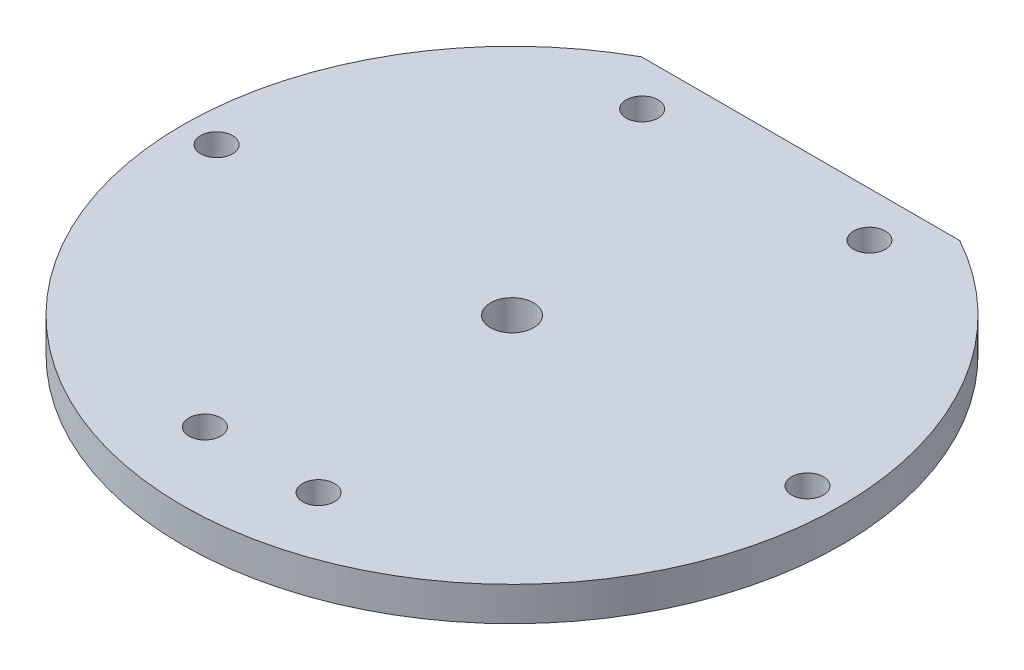
ISO-10303-21;
HEADER;
FILE_DESCRIPTION(('STEP AP214'),'2;1');
FILE_NAME('part.step','',(''),(''),'','','');
FILE_SCHEMA(('AUTOMOTIVE_DESIGN { 1 0 10303 214 1 1 1 1 }'));
ENDSEC;
DATA;
#1=APPLICATION_CONTEXT('core data for automotive mechanical design processes');
#2=APPLICATION_PROTOCOL_DEFINITION('international standard','automotive_design',2000,#1);
#3=PRODUCT_CONTEXT('',#1,'mechanical');
#4=PRODUCT('Part','Part','',(#3));
#5=PRODUCT_RELATED_PRODUCT_CATEGORY('part','',(#4));
#6=PRODUCT_DEFINITION_FORMATION('','',#4);
#7=PRODUCT_DEFINITION_CONTEXT('part definition',#1,'design');
#8=PRODUCT_DEFINITION('design','',#6,#7);
#9=PRODUCT_DEFINITION_SHAPE('','',#8);
#10=(LENGTH_UNIT() NAMED_UNIT(*) SI_UNIT(.MILLI.,.METRE.));
#11=(NAMED_UNIT(*) PLANE_ANGLE_UNIT() SI_UNIT($,.RADIAN.));
#12=(NAMED_UNIT(*) SI_UNIT($,.STERADIAN.) SOLID_ANGLE_UNIT());
#13=UNCERTAINTY_MEASURE_WITH_UNIT(LENGTH_MEASURE(1.E-05),#10,'distance_accuracy_value','');
#14=(GEOMETRIC_REPRESENTATION_CONTEXT(3) GLOBAL_UNCERTAINTY_ASSIGNED_CONTEXT((#13)) GLOBAL_UNIT_ASSIGNED_CONTEXT((#10,
#11,#12)) REPRESENTATION_CONTEXT('',''));
#15=CARTESIAN_POINT('',(0.,0.,0.));
#16=DIRECTION('',(0.,0.,1.));
#17=DIRECTION('',(1.,0.,0.));
#18=AXIS2_PLACEMENT_3D('',#15,#16,#17);
#19=CARTESIAN_POINT('',(0.,3.,0.));
#20=DIRECTION('',(0.,-1.,0.));
#21=DIRECTION('',(0.,0.,-1.));
#22=AXIS2_PLACEMENT_3D('',#19,#20,#21);
#23=CYLINDRICAL_SURFACE('',#22,29.);
#24=CARTESIAN_POINT('',(0.,3.,0.));
#25=DIRECTION('',(0.,1.,0.));
#26=DIRECTION('',(0.,0.,1.));
#27=AXIS2_PLACEMENT_3D('',#24,#25,#26);
#28=CIRCLE('',#27,29.);
#29=CARTESIAN_POINT('',(-14.,3.,-25.3968501984006));
#30=VERTEX_POINT('',#29);
#31=CARTESIAN_POINT('',(14.,3.,-25.3968501984006));
#32=VERTEX_POINT('',#31);
#33=EDGE_CURVE('E70',#30,#32,#28,.T.);
#34=ORIENTED_EDGE('',*,*,#33,.F.);
#35=DIRECTION('',(0.,1.,0.));
#36=VECTOR('',#35,1.);
#37=CARTESIAN_POINT('',(-14.,-7.,-25.3968501984006));
#38=LINE('',#37,#36);
#39=CARTESIAN_POINT('',(-14.,0.,-25.3968501984006));
#40=VERTEX_POINT('',#39);
#41=EDGE_CURVE('E63',#40,#30,#38,.T.);
#42=ORIENTED_EDGE('',*,*,#41,.F.);
#43=CARTESIAN_POINT('',(0.,0.,0.));
#44=DIRECTION('',(0.,1.,0.));
#45=DIRECTION('',(0.,0.,1.));
#46=AXIS2_PLACEMENT_3D('',#43,#44,#45);
#47=CIRCLE('',#46,29.);
#48=CARTESIAN_POINT('',(14.,0.,-25.3968501984006));
#49=VERTEX_POINT('',#48);
#50=EDGE_CURVE('E72',#40,#49,#47,.T.);
#51=ORIENTED_EDGE('',*,*,#50,.T.);
#52=DIRECTION('',(0.,1.,0.));
#53=VECTOR('',#52,1.);
#54=CARTESIAN_POINT('',(14.,-7.,-25.3968501984006));
#55=LINE('',#54,#53);
#56=EDGE_CURVE('E53',#49,#32,#55,.T.);
#57=ORIENTED_EDGE('',*,*,#56,.T.);
#58=EDGE_LOOP('',(#34,#42,#51,#57));
#59=FACE_BOUND('',#58,.T.);
#60=ADVANCED_FACE('F37',(#59),#23,.T.);
#61=CARTESIAN_POINT('',(0.,3.,0.));
#62=DIRECTION('',(0.,1.,0.));
#63=DIRECTION('',(0.,0.,1.));
#64=AXIS2_PLACEMENT_3D('',#61,#62,#63);
#65=PLANE('',#64);
#66=CARTESIAN_POINT('',(-5.,3.,22.0259541949482));
#67=DIRECTION('',(0.,1.,0.));
#68=DIRECTION('',(0.,0.,1.));
#69=AXIS2_PLACEMENT_3D('',#66,#67,#68);
#70=CIRCLE('',#69,1.4);
#71=CARTESIAN_POINT('',(-5.,3.,23.4259541949482));
#72=VERTEX_POINT('',#71);
#73=EDGE_CURVE('E101',#72,#72,#70,.T.);
#74=ORIENTED_EDGE('',*,*,#73,.F.);
#75=EDGE_LOOP('',(#74));
#76=FACE_BOUND('',#75,.T.);
#77=CARTESIAN_POINT('',(5.,3.,22.0259541949482));
#78=DIRECTION('',(0.,1.,0.));
#79=DIRECTION('',(0.,0.,-1.));
#80=AXIS2_PLACEMENT_3D('',#77,#78,#79);
#81=CIRCLE('',#80,1.4);
#82=CARTESIAN_POINT('',(5.,3.,20.6259541949482));
#83=VERTEX_POINT('',#82);
#84=EDGE_CURVE('E106',#83,#83,#81,.T.);
#85=ORIENTED_EDGE('',*,*,#84,.F.);
#86=EDGE_LOOP('',(#85));
#87=FACE_BOUND('',#86,.T.);
#88=DIRECTION('',(1.,0.,0.));
#89=VECTOR('',#88,1.);
#90=CARTESIAN_POINT('',(0.,3.,-25.3968501984006));
#91=LINE('',#90,#89);
#92=EDGE_CURVE('E61',#30,#32,#91,.T.);
#93=ORIENTED_EDGE('',*,*,#92,.F.);
#94=ORIENTED_EDGE('',*,*,#33,.T.);
#95=EDGE_LOOP('',(#93,#94));
#96=FACE_BOUND('',#95,.T.);
#97=CARTESIAN_POINT('',(-10.,3.,-21.4516570642615));
#98=DIRECTION('',(0.,1.,0.));
#99=DIRECTION('',(0.,0.,1.));
#100=AXIS2_PLACEMENT_3D('',#97,#98,#99);
#101=CIRCLE('',#100,1.4);
#102=CARTESIAN_POINT('',(-10.,3.,-20.0516570642616));
#103=VERTEX_POINT('',#102);
#104=EDGE_CURVE('E96',#103,#103,#101,.T.);
#105=ORIENTED_EDGE('',*,*,#104,.F.);
#106=EDGE_LOOP('',(#105));
#107=FACE_BOUND('',#106,.T.);
#108=CARTESIAN_POINT('',(10.,3.,-21.4516570642616));
#109=DIRECTION('',(0.,1.,0.));
#110=DIRECTION('',(0.,0.,1.));
#111=AXIS2_PLACEMENT_3D('',#108,#109,#110);
#112=CIRCLE('',#111,1.4);
#113=CARTESIAN_POINT('',(10.,3.,-20.0516570642616));
#114=VERTEX_POINT('',#113);
#115=EDGE_CURVE('E113',#114,#114,#112,.T.);
#116=ORIENTED_EDGE('',*,*,#115,.F.);
#117=EDGE_LOOP('',(#116));
#118=FACE_BOUND('',#117,.T.);
#119=CARTESIAN_POINT('',(26.,3.,0.));
#120=DIRECTION('',(0.,1.,0.));
#121=DIRECTION('',(0.,0.,1.));
#122=AXIS2_PLACEMENT_3D('',#119,#120,#121);
#123=CIRCLE('',#122,1.4);
#124=CARTESIAN_POINT('',(26.,3.,1.4));
#125=VERTEX_POINT('',#124);
#126=EDGE_CURVE('E88',#125,#125,#123,.T.);
#127=ORIENTED_EDGE('',*,*,#126,.F.);
#128=EDGE_LOOP('',(#127));
#129=FACE_BOUND('',#128,.T.);
#130=CARTESIAN_POINT('',(-26.,3.,0.));
#131=DIRECTION('',(0.,1.,0.));
#132=DIRECTION('',(0.,0.,-1.));
#133=AXIS2_PLACEMENT_3D('',#130,#131,#132);
#134=CIRCLE('',#133,1.4);
#135=CARTESIAN_POINT('',(-26.,3.,-1.4));
#136=VERTEX_POINT('',#135);
#137=EDGE_CURVE('E98',#136,#136,#134,.T.);
#138=ORIENTED_EDGE('',*,*,#137,.F.);
#139=EDGE_LOOP('',(#138));
#140=FACE_BOUND('',#139,.T.);
#141=CARTESIAN_POINT('',(0.,3.,0.));
#142=DIRECTION('',(0.,1.,0.));
#143=DIRECTION('',(0.,0.,1.));
#144=AXIS2_PLACEMENT_3D('',#141,#142,#143);
#145=CIRCLE('',#144,1.9);
#146=CARTESIAN_POINT('',(0.,3.,1.9));
#147=VERTEX_POINT('',#146);
#148=EDGE_CURVE('E91',#147,#147,#145,.T.);
#149=ORIENTED_EDGE('',*,*,#148,.F.);
#150=EDGE_LOOP('',(#149));
#151=FACE_BOUND('',#150,.T.);
#152=ADVANCED_FACE('F74',(#76,#87,#96,#107,#118,#129,#140,#151),#65,.T.);
#153=CARTESIAN_POINT('',(0.,0.,0.));
#154=DIRECTION('',(0.,1.,0.));
#155=DIRECTION('',(0.,0.,1.));
#156=AXIS2_PLACEMENT_3D('',#153,#154,#155);
#157=PLANE('',#156);
#158=CARTESIAN_POINT('',(-5.,0.,22.0259541949482));
#159=DIRECTION('',(0.,1.,0.));
#160=DIRECTION('',(0.,0.,1.));
#161=AXIS2_PLACEMENT_3D('',#158,#159,#160);
#162=CIRCLE('',#161,1.4);
#163=CARTESIAN_POINT('',(-5.,0.,23.4259541949482));
#164=VERTEX_POINT('',#163);
#165=EDGE_CURVE('E40',#164,#164,#162,.T.);
#166=ORIENTED_EDGE('',*,*,#165,.T.);
#167=EDGE_LOOP('',(#166));
#168=FACE_BOUND('',#167,.T.);
#169=CARTESIAN_POINT('',(5.,0.,22.0259541949482));
#170=DIRECTION('',(0.,1.,0.));
#171=DIRECTION('',(0.,0.,1.));
#172=AXIS2_PLACEMENT_3D('',#169,#170,#171);
#173=CIRCLE('',#172,1.4);
#174=CARTESIAN_POINT('',(5.,0.,23.4259541949482));
#175=VERTEX_POINT('',#174);
#176=EDGE_CURVE('E99',#175,#175,#173,.T.);
#177=ORIENTED_EDGE('',*,*,#176,.T.);
#178=EDGE_LOOP('',(#177));
#179=FACE_BOUND('',#178,.T.);
#180=CARTESIAN_POINT('',(-10.,0.,-21.4516570642615));
#181=DIRECTION('',(0.,1.,0.));
#182=DIRECTION('',(0.,0.,1.));
#183=AXIS2_PLACEMENT_3D('',#180,#181,#182);
#184=CIRCLE('',#183,1.4);
#185=CARTESIAN_POINT('',(-10.,0.,-20.0516570642616));
#186=VERTEX_POINT('',#185);
#187=EDGE_CURVE('E95',#186,#186,#184,.T.);
#188=ORIENTED_EDGE('',*,*,#187,.T.);
#189=EDGE_LOOP('',(#188));
#190=FACE_BOUND('',#189,.T.);
#191=CARTESIAN_POINT('',(10.,0.,-21.4516570642616));
#192=DIRECTION('',(0.,1.,0.));
#193=DIRECTION('',(0.,0.,1.));
#194=AXIS2_PLACEMENT_3D('',#191,#192,#193);
#195=CIRCLE('',#194,1.4);
#196=CARTESIAN_POINT('',(10.,0.,-20.0516570642616));
#197=VERTEX_POINT('',#196);
#198=EDGE_CURVE('E92',#197,#197,#195,.T.);
#199=ORIENTED_EDGE('',*,*,#198,.T.);
#200=EDGE_LOOP('',(#199));
#201=FACE_BOUND('',#200,.T.);
#202=CARTESIAN_POINT('',(26.,0.,0.));
#203=DIRECTION('',(0.,1.,0.));
#204=DIRECTION('',(0.,0.,1.));
#205=AXIS2_PLACEMENT_3D('',#202,#203,#204);
#206=CIRCLE('',#205,1.4);
#207=CARTESIAN_POINT('',(26.,0.,1.4));
#208=VERTEX_POINT('',#207);
#209=EDGE_CURVE('E87',#208,#208,#206,.T.);
#210=ORIENTED_EDGE('',*,*,#209,.T.);
#211=EDGE_LOOP('',(#210));
#212=FACE_BOUND('',#211,.T.);
#213=CARTESIAN_POINT('',(-26.,0.,0.));
#214=DIRECTION('',(0.,1.,0.));
#215=DIRECTION('',(0.,0.,1.));
#216=AXIS2_PLACEMENT_3D('',#213,#214,#215);
#217=CIRCLE('',#216,1.4);
#218=CARTESIAN_POINT('',(-26.,0.,1.4));
#219=VERTEX_POINT('',#218);
#220=EDGE_CURVE('E84',#219,#219,#217,.T.);
#221=ORIENTED_EDGE('',*,*,#220,.T.);
#222=EDGE_LOOP('',(#221));
#223=FACE_BOUND('',#222,.T.);
#224=CARTESIAN_POINT('',(0.,0.,0.));
#225=DIRECTION('',(0.,1.,0.));
#226=DIRECTION('',(0.,0.,1.));
#227=AXIS2_PLACEMENT_3D('',#224,#225,#226);
#228=CIRCLE('',#227,4.);
#229=CARTESIAN_POINT('',(0.,0.,4.));
#230=VERTEX_POINT('',#229);
#231=EDGE_CURVE('E45',#230,#230,#228,.F.);
#232=ORIENTED_EDGE('',*,*,#231,.F.);
#233=EDGE_LOOP('',(#232));
#234=FACE_BOUND('',#233,.T.);
#235=ORIENTED_EDGE('',*,*,#50,.F.);
#236=DIRECTION('',(1.,0.,0.));
#237=VECTOR('',#236,1.);
#238=CARTESIAN_POINT('',(0.,0.,-25.3968501984006));
#239=LINE('',#238,#237);
#240=EDGE_CURVE('E11',#40,#49,#239,.T.);
#241=ORIENTED_EDGE('',*,*,#240,.T.);
#242=EDGE_LOOP('',(#235,#241));
#243=FACE_BOUND('',#242,.T.);
#244=ADVANCED_FACE('F131',(#168,#179,#190,#201,#212,#223,#234,#243),#157,.F.);
#245=CARTESIAN_POINT('',(0.,-4.,0.));
#246=DIRECTION('',(0.,1.,0.));
#247=DIRECTION('',(0.,0.,1.));
#248=AXIS2_PLACEMENT_3D('',#245,#246,#247);
#249=CYLINDRICAL_SURFACE('',#248,4.);
#250=CARTESIAN_POINT('',(0.,-4.,0.));
#251=DIRECTION('',(0.,-1.,0.));
#252=DIRECTION('',(0.,0.,-1.));
#253=AXIS2_PLACEMENT_3D('',#250,#251,#252);
#254=CIRCLE('',#253,4.);
#255=CARTESIAN_POINT('',(0.,-4.,-4.));
#256=VERTEX_POINT('',#255);
#257=EDGE_CURVE('E79',#256,#256,#254,.T.);
#258=ORIENTED_EDGE('',*,*,#257,.F.);
#259=EDGE_LOOP('',(#258));
#260=FACE_BOUND('',#259,.T.);
#261=ORIENTED_EDGE('',*,*,#231,.T.);
#262=EDGE_LOOP('',(#261));
#263=FACE_BOUND('',#262,.T.);
#264=ADVANCED_FACE('F138',(#260,#263),#249,.T.);
#265=CARTESIAN_POINT('',(0.,-4.,0.));
#266=DIRECTION('',(0.,-1.,0.));
#267=DIRECTION('',(0.,0.,-1.));
#268=AXIS2_PLACEMENT_3D('',#265,#266,#267);
#269=PLANE('',#268);
#270=CARTESIAN_POINT('',(0.,-4.,0.));
#271=DIRECTION('',(0.,1.,0.));
#272=DIRECTION('',(0.,0.,1.));
#273=AXIS2_PLACEMENT_3D('',#270,#271,#272);
#274=CIRCLE('',#273,1.9);
#275=CARTESIAN_POINT('',(0.,-4.,1.9));
#276=VERTEX_POINT('',#275);
#277=EDGE_CURVE('E123',#276,#276,#274,.T.);
#278=ORIENTED_EDGE('',*,*,#277,.T.);
#279=EDGE_LOOP('',(#278));
#280=FACE_BOUND('',#279,.T.);
#281=ORIENTED_EDGE('',*,*,#257,.T.);
#282=EDGE_LOOP('',(#281));
#283=FACE_BOUND('',#282,.T.);
#284=ADVANCED_FACE('F144',(#280,#283),#269,.T.);
#285=CARTESIAN_POINT('',(0.,-4.,0.));
#286=DIRECTION('',(0.,1.,0.));
#287=DIRECTION('',(0.,0.,1.));
#288=AXIS2_PLACEMENT_3D('',#285,#286,#287);
#289=CYLINDRICAL_SURFACE('',#288,1.9);
#290=ORIENTED_EDGE('',*,*,#277,.F.);
#291=EDGE_LOOP('',(#290));
#292=FACE_BOUND('',#291,.T.);
#293=ORIENTED_EDGE('',*,*,#148,.T.);
#294=EDGE_LOOP('',(#293));
#295=FACE_BOUND('',#294,.T.);
#296=ADVANCED_FACE('F128',(#292,#295),#289,.F.);
#297=CARTESIAN_POINT('',(-26.,-7.,0.));
#298=DIRECTION('',(0.,1.,0.));
#299=DIRECTION('',(0.,0.,1.));
#300=AXIS2_PLACEMENT_3D('',#297,#298,#299);
#301=CYLINDRICAL_SURFACE('',#300,1.4);
#302=ORIENTED_EDGE('',*,*,#137,.T.);
#303=EDGE_LOOP('',(#302));
#304=FACE_BOUND('',#303,.T.);
#305=ORIENTED_EDGE('',*,*,#220,.F.);
#306=EDGE_LOOP('',(#305));
#307=FACE_BOUND('',#306,.T.);
#308=ADVANCED_FACE('F151',(#304,#307),#301,.F.);
#309=CARTESIAN_POINT('',(26.,-7.,0.));
#310=DIRECTION('',(0.,1.,0.));
#311=DIRECTION('',(0.,0.,1.));
#312=AXIS2_PLACEMENT_3D('',#309,#310,#311);
#313=CYLINDRICAL_SURFACE('',#312,1.4);
#314=ORIENTED_EDGE('',*,*,#126,.T.);
#315=EDGE_LOOP('',(#314));
#316=FACE_BOUND('',#315,.T.);
#317=ORIENTED_EDGE('',*,*,#209,.F.);
#318=EDGE_LOOP('',(#317));
#319=FACE_BOUND('',#318,.T.);
#320=ADVANCED_FACE('F155',(#316,#319),#313,.F.);
#321=CARTESIAN_POINT('',(10.,-7.,-21.4516570642616));
#322=DIRECTION('',(0.,1.,0.));
#323=DIRECTION('',(0.,0.,1.));
#324=AXIS2_PLACEMENT_3D('',#321,#322,#323);
#325=CYLINDRICAL_SURFACE('',#324,1.4);
#326=ORIENTED_EDGE('',*,*,#115,.T.);
#327=EDGE_LOOP('',(#326));
#328=FACE_BOUND('',#327,.T.);
#329=ORIENTED_EDGE('',*,*,#198,.F.);
#330=EDGE_LOOP('',(#329));
#331=FACE_BOUND('',#330,.T.);
#332=ADVANCED_FACE('F159',(#328,#331),#325,.F.);
#333=CARTESIAN_POINT('',(-10.,-7.,-21.4516570642615));
#334=DIRECTION('',(0.,1.,0.));
#335=DIRECTION('',(0.,0.,1.));
#336=AXIS2_PLACEMENT_3D('',#333,#334,#335);
#337=CYLINDRICAL_SURFACE('',#336,1.4);
#338=ORIENTED_EDGE('',*,*,#104,.T.);
#339=EDGE_LOOP('',(#338));
#340=FACE_BOUND('',#339,.T.);
#341=ORIENTED_EDGE('',*,*,#187,.F.);
#342=EDGE_LOOP('',(#341));
#343=FACE_BOUND('',#342,.T.);
#344=ADVANCED_FACE('F163',(#340,#343),#337,.F.);
#345=CARTESIAN_POINT('',(0.,-7.,-25.3968501984006));
#346=DIRECTION('',(0.,0.,1.));
#347=DIRECTION('',(1.,0.,0.));
#348=AXIS2_PLACEMENT_3D('',#345,#346,#347);
#349=PLANE('',#348);
#350=ORIENTED_EDGE('',*,*,#41,.T.);
#351=ORIENTED_EDGE('',*,*,#92,.T.);
#352=ORIENTED_EDGE('',*,*,#56,.F.);
#353=ORIENTED_EDGE('',*,*,#240,.F.);
#354=EDGE_LOOP('',(#350,#351,#352,#353));
#355=FACE_BOUND('',#354,.T.);
#356=ADVANCED_FACE('F62',(#355),#349,.F.);
#357=CARTESIAN_POINT('',(5.,-7.,22.0259541949482));
#358=DIRECTION('',(0.,1.,0.));
#359=DIRECTION('',(0.,0.,1.));
#360=AXIS2_PLACEMENT_3D('',#357,#358,#359);
#361=CYLINDRICAL_SURFACE('',#360,1.4);
#362=ORIENTED_EDGE('',*,*,#84,.T.);
#363=EDGE_LOOP('',(#362));
#364=FACE_BOUND('',#363,.T.);
#365=ORIENTED_EDGE('',*,*,#176,.F.);
#366=EDGE_LOOP('',(#365));
#367=FACE_BOUND('',#366,.T.);
#368=ADVANCED_FACE('F170',(#364,#367),#361,.F.);
#369=CARTESIAN_POINT('',(-5.,-7.,22.0259541949482));
#370=DIRECTION('',(0.,1.,0.));
#371=DIRECTION('',(0.,0.,1.));
#372=AXIS2_PLACEMENT_3D('',#369,#370,#371);
#373=CYLINDRICAL_SURFACE('',#372,1.4);
#374=ORIENTED_EDGE('',*,*,#73,.T.);
#375=EDGE_LOOP('',(#374));
#376=FACE_BOUND('',#375,.T.);
#377=ORIENTED_EDGE('',*,*,#165,.F.);
#378=EDGE_LOOP('',(#377));
#379=FACE_BOUND('',#378,.T.);
#380=ADVANCED_FACE('F173',(#376,#379),#373,.F.);
#381=CLOSED_SHELL('',(#60,#152,#244,#264,#284,#296,#308,#320,#332,#344,#356,#368,#380));
#382=MANIFOLD_SOLID_BREP('B2',#381);
#383=ADVANCED_BREP_SHAPE_REPRESENTATION('',(#18,#382),#14);
#384=SHAPE_DEFINITION_REPRESENTATION(#9,#383);
ENDSEC;
END-ISO-10303-21;
